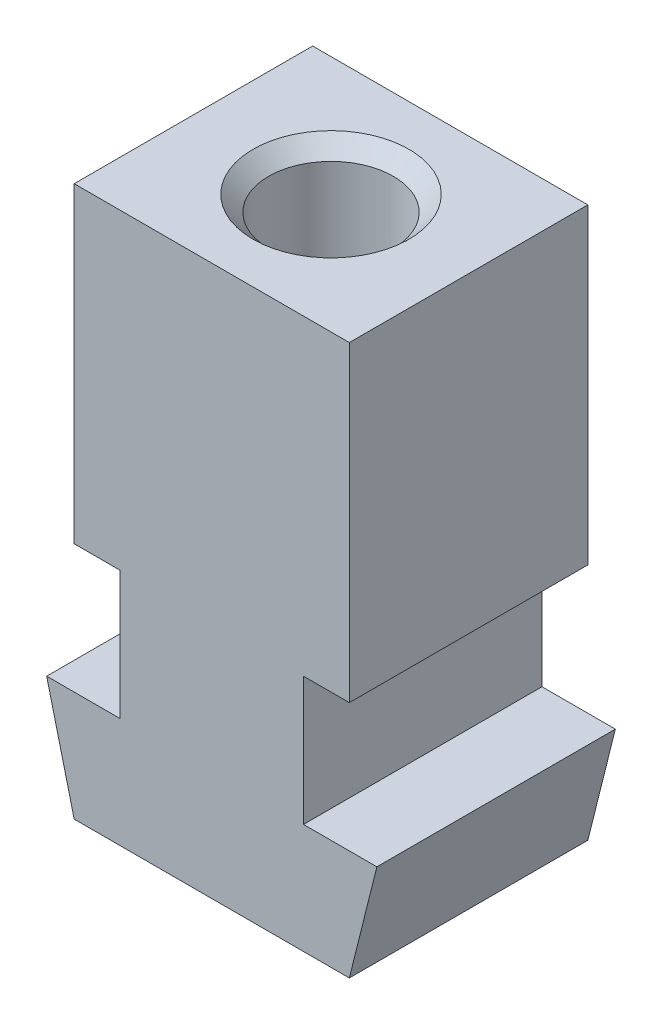
ISO-10303-21;
HEADER;
FILE_DESCRIPTION(('STEP AP214'),'2;1');
FILE_NAME('part.step','',(''),(''),'','','');
FILE_SCHEMA(('AUTOMOTIVE_DESIGN { 1 0 10303 214 1 1 1 1 }'));
ENDSEC;
DATA;
#1=APPLICATION_CONTEXT('core data for automotive mechanical design processes');
#2=APPLICATION_PROTOCOL_DEFINITION('international standard','automotive_design',2000,#1);
#3=PRODUCT_CONTEXT('',#1,'mechanical');
#4=PRODUCT('Part','Part','',(#3));
#5=PRODUCT_RELATED_PRODUCT_CATEGORY('part','',(#4));
#6=PRODUCT_DEFINITION_FORMATION('','',#4);
#7=PRODUCT_DEFINITION_CONTEXT('part definition',#1,'design');
#8=PRODUCT_DEFINITION('design','',#6,#7);
#9=PRODUCT_DEFINITION_SHAPE('','',#8);
#10=(LENGTH_UNIT() NAMED_UNIT(*) SI_UNIT(.MILLI.,.METRE.));
#11=(NAMED_UNIT(*) PLANE_ANGLE_UNIT() SI_UNIT($,.RADIAN.));
#12=(NAMED_UNIT(*) SI_UNIT($,.STERADIAN.) SOLID_ANGLE_UNIT());
#13=UNCERTAINTY_MEASURE_WITH_UNIT(LENGTH_MEASURE(1.E-05),#10,'distance_accuracy_value','');
#14=(GEOMETRIC_REPRESENTATION_CONTEXT(3) GLOBAL_UNCERTAINTY_ASSIGNED_CONTEXT((#13)) GLOBAL_UNIT_ASSIGNED_CONTEXT((#10,
#11,#12)) REPRESENTATION_CONTEXT('',''));
#15=CARTESIAN_POINT('',(0.,0.,0.));
#16=DIRECTION('',(0.,0.,1.));
#17=DIRECTION('',(1.,0.,0.));
#18=AXIS2_PLACEMENT_3D('',#15,#16,#17);
#19=CARTESIAN_POINT('',(0.,30.,0.));
#20=DIRECTION('',(0.,1.,0.));
#21=DIRECTION('',(0.,0.,1.));
#22=AXIS2_PLACEMENT_3D('',#19,#20,#21);
#23=CYLINDRICAL_SURFACE('',#22,3.39999999999999);
#24=CARTESIAN_POINT('',(0.,0.850000000014006,0.));
#25=DIRECTION('',(0.,-1.,0.));
#26=DIRECTION('',(0.,0.,-1.));
#27=AXIS2_PLACEMENT_3D('',#24,#25,#26);
#28=CIRCLE('',#27,3.39999999994234);
#29=CARTESIAN_POINT('',(0.,0.850000000014006,-3.39999999994234));
#30=VERTEX_POINT('',#29);
#31=EDGE_CURVE('E138',#30,#30,#28,.T.);
#32=ORIENTED_EDGE('',*,*,#31,.T.);
#33=EDGE_LOOP('',(#32));
#34=FACE_BOUND('',#33,.T.);
#35=CARTESIAN_POINT('',(0.,29.1499999999587,0.));
#36=DIRECTION('',(0.,1.,0.));
#37=DIRECTION('',(0.,0.,1.));
#38=AXIS2_PLACEMENT_3D('',#35,#36,#37);
#39=CIRCLE('',#38,3.40000000005602);
#40=CARTESIAN_POINT('',(0.,29.1499999999587,3.40000000005602));
#41=VERTEX_POINT('',#40);
#42=EDGE_CURVE('E117',#41,#41,#39,.T.);
#43=ORIENTED_EDGE('',*,*,#42,.T.);
#44=EDGE_LOOP('',(#43));
#45=FACE_BOUND('',#44,.T.);
#46=ADVANCED_FACE('F15',(#34,#45),#23,.F.);
#47=CARTESIAN_POINT('',(0.,0.,0.));
#48=DIRECTION('',(0.,-1.,0.));
#49=DIRECTION('',(0.,0.,-1.));
#50=AXIS2_PLACEMENT_3D('',#47,#48,#49);
#51=CONICAL_SURFACE('',#50,4.25000000001319,0.785398163430886);
#52=CARTESIAN_POINT('',(0.,0.,0.));
#53=DIRECTION('',(0.,-1.,0.));
#54=DIRECTION('',(0.,0.,-1.));
#55=AXIS2_PLACEMENT_3D('',#52,#53,#54);
#56=CIRCLE('',#55,4.25000000001319);
#57=CARTESIAN_POINT('',(0.,0.,-4.25000000001319));
#58=VERTEX_POINT('',#57);
#59=EDGE_CURVE('E18',#58,#58,#56,.T.);
#60=ORIENTED_EDGE('',*,*,#59,.T.);
#61=EDGE_LOOP('',(#60));
#62=FACE_BOUND('',#61,.T.);
#63=ORIENTED_EDGE('',*,*,#31,.F.);
#64=EDGE_LOOP('',(#63));
#65=FACE_BOUND('',#64,.T.);
#66=ADVANCED_FACE('F200',(#62,#65),#51,.F.);
#67=CARTESIAN_POINT('',(0.,29.9999999999727,0.));
#68=DIRECTION('',(0.,1.,0.));
#69=DIRECTION('',(0.,0.,1.));
#70=AXIS2_PLACEMENT_3D('',#67,#68,#69);
#71=CONICAL_SURFACE('',#70,4.25000000007003,0.785398163397448);
#72=ORIENTED_EDGE('',*,*,#42,.F.);
#73=EDGE_LOOP('',(#72));
#74=FACE_BOUND('',#73,.T.);
#75=CARTESIAN_POINT('',(0.,29.9999999999727,0.));
#76=DIRECTION('',(0.,1.,0.));
#77=DIRECTION('',(0.,0.,1.));
#78=AXIS2_PLACEMENT_3D('',#75,#76,#77);
#79=CIRCLE('',#78,4.25000000007003);
#80=CARTESIAN_POINT('',(0.,29.9999999999727,4.25000000007003));
#81=VERTEX_POINT('',#80);
#82=EDGE_CURVE('E141',#81,#81,#79,.T.);
#83=ORIENTED_EDGE('',*,*,#82,.T.);
#84=EDGE_LOOP('',(#83));
#85=FACE_BOUND('',#84,.T.);
#86=ADVANCED_FACE('F464',(#74,#85),#71,.F.);
#87=CARTESIAN_POINT('',(0.,0.,-6.5));
#88=DIRECTION('',(0.,0.,1.));
#89=DIRECTION('',(1.,0.,0.));
#90=AXIS2_PLACEMENT_3D('',#87,#88,#89);
#91=PLANE('',#90);
#92=DIRECTION('',(0.,1.,0.));
#93=VECTOR('',#92,1.);
#94=CARTESIAN_POINT('',(-5.00000000000001,13.,-6.5));
#95=LINE('',#94,#93);
#96=CARTESIAN_POINT('',(-5.00000000000001,6.,-6.5));
#97=VERTEX_POINT('',#96);
#98=CARTESIAN_POINT('',(-5.00000000000001,13.,-6.5));
#99=VERTEX_POINT('',#98);
#100=EDGE_CURVE('E289',#97,#99,#95,.T.);
#101=ORIENTED_EDGE('',*,*,#100,.T.);
#102=DIRECTION('',(1.,0.,0.));
#103=VECTOR('',#102,1.);
#104=CARTESIAN_POINT('',(-7.50000000000001,13.,-6.5));
#105=LINE('',#104,#103);
#106=CARTESIAN_POINT('',(-7.50000000000001,13.,-6.5));
#107=VERTEX_POINT('',#106);
#108=EDGE_CURVE('E296',#99,#107,#105,.F.);
#109=ORIENTED_EDGE('',*,*,#108,.T.);
#110=DIRECTION('',(0.,1.,0.));
#111=VECTOR('',#110,1.);
#112=CARTESIAN_POINT('',(-7.50000000000001,30.,-6.5));
#113=LINE('',#112,#111);
#114=CARTESIAN_POINT('',(-7.50000000000001,30.,-6.5));
#115=VERTEX_POINT('',#114);
#116=EDGE_CURVE('E303',#107,#115,#113,.T.);
#117=ORIENTED_EDGE('',*,*,#116,.T.);
#118=DIRECTION('',(1.,0.,0.));
#119=VECTOR('',#118,1.);
#120=CARTESIAN_POINT('',(-7.50000000000001,30.,-6.5));
#121=LINE('',#120,#119);
#122=CARTESIAN_POINT('',(7.50000000000001,30.,-6.5));
#123=VERTEX_POINT('',#122);
#124=EDGE_CURVE('E151',#115,#123,#121,.T.);
#125=ORIENTED_EDGE('',*,*,#124,.T.);
#126=DIRECTION('',(0.,-1.,0.));
#127=VECTOR('',#126,1.);
#128=CARTESIAN_POINT('',(7.50000000000001,30.,-6.5));
#129=LINE('',#128,#127);
#130=CARTESIAN_POINT('',(7.50000000000001,13.,-6.5));
#131=VERTEX_POINT('',#130);
#132=EDGE_CURVE('E145',#123,#131,#129,.T.);
#133=ORIENTED_EDGE('',*,*,#132,.T.);
#134=DIRECTION('',(1.,0.,0.));
#135=VECTOR('',#134,1.);
#136=CARTESIAN_POINT('',(7.50000000000001,13.,-6.5));
#137=LINE('',#136,#135);
#138=CARTESIAN_POINT('',(5.00000000000001,13.,-6.5));
#139=VERTEX_POINT('',#138);
#140=EDGE_CURVE('E161',#131,#139,#137,.F.);
#141=ORIENTED_EDGE('',*,*,#140,.T.);
#142=DIRECTION('',(0.,-1.,0.));
#143=VECTOR('',#142,1.);
#144=CARTESIAN_POINT('',(5.00000000000001,13.,-6.5));
#145=LINE('',#144,#143);
#146=CARTESIAN_POINT('',(5.00000000000001,6.,-6.5));
#147=VERTEX_POINT('',#146);
#148=EDGE_CURVE('E170',#139,#147,#145,.T.);
#149=ORIENTED_EDGE('',*,*,#148,.T.);
#150=DIRECTION('',(1.,0.,0.));
#151=VECTOR('',#150,1.);
#152=CARTESIAN_POINT('',(5.00000000000001,6.,-6.5));
#153=LINE('',#152,#151);
#154=CARTESIAN_POINT('',(9.00000000000001,5.99999999999999,-6.5));
#155=VERTEX_POINT('',#154);
#156=EDGE_CURVE('E177',#147,#155,#153,.T.);
#157=ORIENTED_EDGE('',*,*,#156,.T.);
#158=DIRECTION('',(-0.242535625036333,-0.970142500145332,0.));
#159=VECTOR('',#158,1.);
#160=CARTESIAN_POINT('',(9.00000000000001,5.99999999999999,-6.50000000000001));
#161=LINE('',#160,#159);
#162=CARTESIAN_POINT('',(7.50000000000001,0.,-6.5));
#163=VERTEX_POINT('',#162);
#164=EDGE_CURVE('E184',#155,#163,#161,.T.);
#165=ORIENTED_EDGE('',*,*,#164,.T.);
#166=DIRECTION('',(1.,0.,0.));
#167=VECTOR('',#166,1.);
#168=CARTESIAN_POINT('',(7.50000000000001,0.,-6.5));
#169=LINE('',#168,#167);
#170=CARTESIAN_POINT('',(-7.50000000000001,0.,-6.5));
#171=VERTEX_POINT('',#170);
#172=EDGE_CURVE('E121',#163,#171,#169,.F.);
#173=ORIENTED_EDGE('',*,*,#172,.T.);
#174=DIRECTION('',(-0.242535625036333,0.970142500145332,0.));
#175=VECTOR('',#174,1.);
#176=CARTESIAN_POINT('',(-9.00000000000001,5.99999999999999,-6.50000000000001));
#177=LINE('',#176,#175);
#178=CARTESIAN_POINT('',(-9.00000000000001,5.99999999999999,-6.5));
#179=VERTEX_POINT('',#178);
#180=EDGE_CURVE('E102',#171,#179,#177,.T.);
#181=ORIENTED_EDGE('',*,*,#180,.T.);
#182=DIRECTION('',(1.,0.,0.));
#183=VECTOR('',#182,1.);
#184=CARTESIAN_POINT('',(-5.00000000000001,6.,-6.5));
#185=LINE('',#184,#183);
#186=EDGE_CURVE('E107',#179,#97,#185,.T.);
#187=ORIENTED_EDGE('',*,*,#186,.T.);
#188=EDGE_LOOP('',(#101,#109,#117,#125,#133,#141,#149,#157,#165,#173,#181,#187));
#189=FACE_BOUND('',#188,.T.);
#190=ADVANCED_FACE('F119',(#189),#91,.F.);
#191=CARTESIAN_POINT('',(-5.00000000000001,6.,6.5));
#192=DIRECTION('',(0.,-1.,0.));
#193=DIRECTION('',(1.,0.,0.));
#194=AXIS2_PLACEMENT_3D('',#191,#192,#193);
#195=PLANE('',#194);
#196=DIRECTION('',(0.,0.,1.));
#197=VECTOR('',#196,1.);
#198=CARTESIAN_POINT('',(-9.00000000000001,5.99999999999999,6.5));
#199=LINE('',#198,#197);
#200=CARTESIAN_POINT('',(-9.00000000000001,5.99999999999999,6.5));
#201=VERTEX_POINT('',#200);
#202=EDGE_CURVE('E109',#179,#201,#199,.T.);
#203=ORIENTED_EDGE('',*,*,#202,.T.);
#204=DIRECTION('',(1.,0.,0.));
#205=VECTOR('',#204,1.);
#206=CARTESIAN_POINT('',(0.,6.,6.5));
#207=LINE('',#206,#205);
#208=CARTESIAN_POINT('',(-5.00000000000001,6.,6.5));
#209=VERTEX_POINT('',#208);
#210=EDGE_CURVE('E286',#209,#201,#207,.F.);
#211=ORIENTED_EDGE('',*,*,#210,.F.);
#212=DIRECTION('',(0.,0.,1.));
#213=VECTOR('',#212,1.);
#214=CARTESIAN_POINT('',(-5.00000000000001,6.,6.5));
#215=LINE('',#214,#213);
#216=EDGE_CURVE('E112',#209,#97,#215,.F.);
#217=ORIENTED_EDGE('',*,*,#216,.T.);
#218=ORIENTED_EDGE('',*,*,#186,.F.);
#219=EDGE_LOOP('',(#203,#211,#217,#218));
#220=FACE_BOUND('',#219,.T.);
#221=ADVANCED_FACE('F108',(#220),#195,.F.);
#222=CARTESIAN_POINT('',(-9.00000000000001,5.99999999999999,6.5));
#223=DIRECTION('',(0.970142500145332,0.242535625036333,0.));
#224=DIRECTION('',(-0.242535625036333,0.970142500145332,0.));
#225=AXIS2_PLACEMENT_3D('',#222,#223,#224);
#226=PLANE('',#225);
#227=DIRECTION('',(0.,0.,1.));
#228=VECTOR('',#227,1.);
#229=CARTESIAN_POINT('',(-7.50000000000001,0.,6.5));
#230=LINE('',#229,#228);
#231=CARTESIAN_POINT('',(-7.50000000000001,0.,6.5));
#232=VERTEX_POINT('',#231);
#233=EDGE_CURVE('E191',#171,#232,#230,.T.);
#234=ORIENTED_EDGE('',*,*,#233,.T.);
#235=DIRECTION('',(0.242535625036333,-0.970142500145332,0.));
#236=VECTOR('',#235,1.);
#237=CARTESIAN_POINT('',(-9.00000000000001,5.99999999999999,6.5));
#238=LINE('',#237,#236);
#239=EDGE_CURVE('E127',#201,#232,#238,.T.);
#240=ORIENTED_EDGE('',*,*,#239,.F.);
#241=ORIENTED_EDGE('',*,*,#202,.F.);
#242=ORIENTED_EDGE('',*,*,#180,.F.);
#243=EDGE_LOOP('',(#234,#240,#241,#242));
#244=FACE_BOUND('',#243,.T.);
#245=ADVANCED_FACE('F125',(#244),#226,.F.);
#246=CARTESIAN_POINT('',(7.50000000000001,0.,6.5));
#247=DIRECTION('',(0.,1.,0.));
#248=DIRECTION('',(0.,0.,1.));
#249=AXIS2_PLACEMENT_3D('',#246,#247,#248);
#250=PLANE('',#249);
#251=DIRECTION('',(0.,0.,1.));
#252=VECTOR('',#251,1.);
#253=CARTESIAN_POINT('',(7.50000000000001,0.,6.5));
#254=LINE('',#253,#252);
#255=CARTESIAN_POINT('',(7.50000000000001,0.,6.5));
#256=VERTEX_POINT('',#255);
#257=EDGE_CURVE('E187',#163,#256,#254,.T.);
#258=ORIENTED_EDGE('',*,*,#257,.T.);
#259=DIRECTION('',(1.,0.,0.));
#260=VECTOR('',#259,1.);
#261=CARTESIAN_POINT('',(0.,0.,6.5));
#262=LINE('',#261,#260);
#263=EDGE_CURVE('E278',#232,#256,#262,.T.);
#264=ORIENTED_EDGE('',*,*,#263,.F.);
#265=ORIENTED_EDGE('',*,*,#233,.F.);
#266=ORIENTED_EDGE('',*,*,#172,.F.);
#267=EDGE_LOOP('',(#258,#264,#265,#266));
#268=FACE_BOUND('',#267,.T.);
#269=ORIENTED_EDGE('',*,*,#59,.F.);
#270=EDGE_LOOP('',(#269));
#271=FACE_BOUND('',#270,.T.);
#272=ADVANCED_FACE('F203',(#268,#271),#250,.F.);
#273=CARTESIAN_POINT('',(9.00000000000001,5.99999999999999,6.5));
#274=DIRECTION('',(-0.970142500145332,0.242535625036333,0.));
#275=DIRECTION('',(-0.242535625036333,-0.970142500145332,0.));
#276=AXIS2_PLACEMENT_3D('',#273,#274,#275);
#277=PLANE('',#276);
#278=DIRECTION('',(0.,0.,1.));
#279=VECTOR('',#278,1.);
#280=CARTESIAN_POINT('',(9.00000000000001,5.99999999999999,6.5));
#281=LINE('',#280,#279);
#282=CARTESIAN_POINT('',(9.00000000000001,5.99999999999999,6.5));
#283=VERTEX_POINT('',#282);
#284=EDGE_CURVE('E181',#155,#283,#281,.T.);
#285=ORIENTED_EDGE('',*,*,#284,.T.);
#286=DIRECTION('',(0.242535625036333,0.970142500145332,0.));
#287=VECTOR('',#286,1.);
#288=CARTESIAN_POINT('',(7.50000000000001,0.,6.5));
#289=LINE('',#288,#287);
#290=EDGE_CURVE('E273',#256,#283,#289,.T.);
#291=ORIENTED_EDGE('',*,*,#290,.F.);
#292=ORIENTED_EDGE('',*,*,#257,.F.);
#293=ORIENTED_EDGE('',*,*,#164,.F.);
#294=EDGE_LOOP('',(#285,#291,#292,#293));
#295=FACE_BOUND('',#294,.T.);
#296=ADVANCED_FACE('F205',(#295),#277,.F.);
#297=CARTESIAN_POINT('',(5.00000000000001,6.,6.5));
#298=DIRECTION('',(0.,-1.,0.));
#299=DIRECTION('',(1.,0.,0.));
#300=AXIS2_PLACEMENT_3D('',#297,#298,#299);
#301=PLANE('',#300);
#302=DIRECTION('',(0.,0.,1.));
#303=VECTOR('',#302,1.);
#304=CARTESIAN_POINT('',(5.00000000000001,6.,6.5));
#305=LINE('',#304,#303);
#306=CARTESIAN_POINT('',(5.00000000000001,6.,6.5));
#307=VERTEX_POINT('',#306);
#308=EDGE_CURVE('E174',#147,#307,#305,.T.);
#309=ORIENTED_EDGE('',*,*,#308,.T.);
#310=DIRECTION('',(1.,0.,0.));
#311=VECTOR('',#310,1.);
#312=CARTESIAN_POINT('',(0.,5.99999999999999,6.5));
#313=LINE('',#312,#311);
#314=EDGE_CURVE('E261',#283,#307,#313,.F.);
#315=ORIENTED_EDGE('',*,*,#314,.F.);
#316=ORIENTED_EDGE('',*,*,#284,.F.);
#317=ORIENTED_EDGE('',*,*,#156,.F.);
#318=EDGE_LOOP('',(#309,#315,#316,#317));
#319=FACE_BOUND('',#318,.T.);
#320=ADVANCED_FACE('F213',(#319),#301,.F.);
#321=CARTESIAN_POINT('',(5.00000000000001,13.,6.5));
#322=DIRECTION('',(-1.,0.,0.));
#323=DIRECTION('',(0.,-1.,0.));
#324=AXIS2_PLACEMENT_3D('',#321,#322,#323);
#325=PLANE('',#324);
#326=DIRECTION('',(0.,0.,1.));
#327=VECTOR('',#326,1.);
#328=CARTESIAN_POINT('',(5.00000000000001,13.,6.5));
#329=LINE('',#328,#327);
#330=CARTESIAN_POINT('',(5.00000000000001,13.,6.5));
#331=VERTEX_POINT('',#330);
#332=EDGE_CURVE('E167',#139,#331,#329,.T.);
#333=ORIENTED_EDGE('',*,*,#332,.T.);
#334=DIRECTION('',(0.,1.,0.));
#335=VECTOR('',#334,1.);
#336=CARTESIAN_POINT('',(5.00000000000001,0.,6.5));
#337=LINE('',#336,#335);
#338=EDGE_CURVE('E264',#307,#331,#337,.T.);
#339=ORIENTED_EDGE('',*,*,#338,.F.);
#340=ORIENTED_EDGE('',*,*,#308,.F.);
#341=ORIENTED_EDGE('',*,*,#148,.F.);
#342=EDGE_LOOP('',(#333,#339,#340,#341));
#343=FACE_BOUND('',#342,.T.);
#344=ADVANCED_FACE('F247',(#343),#325,.F.);
#345=CARTESIAN_POINT('',(7.50000000000001,13.,6.5));
#346=DIRECTION('',(0.,1.,0.));
#347=DIRECTION('',(0.,0.,1.));
#348=AXIS2_PLACEMENT_3D('',#345,#346,#347);
#349=PLANE('',#348);
#350=DIRECTION('',(0.,0.,1.));
#351=VECTOR('',#350,1.);
#352=CARTESIAN_POINT('',(7.50000000000001,13.,6.5));
#353=LINE('',#352,#351);
#354=CARTESIAN_POINT('',(7.50000000000001,13.,6.5));
#355=VERTEX_POINT('',#354);
#356=EDGE_CURVE('E154',#131,#355,#353,.T.);
#357=ORIENTED_EDGE('',*,*,#356,.T.);
#358=DIRECTION('',(1.,0.,0.));
#359=VECTOR('',#358,1.);
#360=CARTESIAN_POINT('',(0.,13.,6.5));
#361=LINE('',#360,#359);
#362=EDGE_CURVE('E269',#331,#355,#361,.T.);
#363=ORIENTED_EDGE('',*,*,#362,.F.);
#364=ORIENTED_EDGE('',*,*,#332,.F.);
#365=ORIENTED_EDGE('',*,*,#140,.F.);
#366=EDGE_LOOP('',(#357,#363,#364,#365));
#367=FACE_BOUND('',#366,.T.);
#368=ADVANCED_FACE('F243',(#367),#349,.F.);
#369=CARTESIAN_POINT('',(7.50000000000001,30.,6.5));
#370=DIRECTION('',(-1.,0.,0.));
#371=DIRECTION('',(0.,-1.,0.));
#372=AXIS2_PLACEMENT_3D('',#369,#370,#371);
#373=PLANE('',#372);
#374=DIRECTION('',(0.,0.,-1.));
#375=VECTOR('',#374,1.);
#376=CARTESIAN_POINT('',(7.50000000000001,30.,6.5));
#377=LINE('',#376,#375);
#378=CARTESIAN_POINT('',(7.50000000000001,30.,6.5));
#379=VERTEX_POINT('',#378);
#380=EDGE_CURVE('E144',#123,#379,#377,.F.);
#381=ORIENTED_EDGE('',*,*,#380,.T.);
#382=DIRECTION('',(0.,1.,0.));
#383=VECTOR('',#382,1.);
#384=CARTESIAN_POINT('',(7.50000000000001,0.,6.5));
#385=LINE('',#384,#383);
#386=EDGE_CURVE('E319',#355,#379,#385,.T.);
#387=ORIENTED_EDGE('',*,*,#386,.F.);
#388=ORIENTED_EDGE('',*,*,#356,.F.);
#389=ORIENTED_EDGE('',*,*,#132,.F.);
#390=EDGE_LOOP('',(#381,#387,#388,#389));
#391=FACE_BOUND('',#390,.T.);
#392=ADVANCED_FACE('F239',(#391),#373,.F.);
#393=CARTESIAN_POINT('',(-7.50000000000001,30.,6.5));
#394=DIRECTION('',(0.,-1.,0.));
#395=DIRECTION('',(0.,0.,-1.));
#396=AXIS2_PLACEMENT_3D('',#393,#394,#395);
#397=PLANE('',#396);
#398=DIRECTION('',(0.,0.,1.));
#399=VECTOR('',#398,1.);
#400=CARTESIAN_POINT('',(-7.50000000000001,30.,6.5));
#401=LINE('',#400,#399);
#402=CARTESIAN_POINT('',(-7.50000000000001,30.,6.5));
#403=VERTEX_POINT('',#402);
#404=EDGE_CURVE('E307',#115,#403,#401,.T.);
#405=ORIENTED_EDGE('',*,*,#404,.T.);
#406=DIRECTION('',(1.,0.,0.));
#407=VECTOR('',#406,1.);
#408=CARTESIAN_POINT('',(0.,30.,6.5));
#409=LINE('',#408,#407);
#410=EDGE_CURVE('E316',#379,#403,#409,.F.);
#411=ORIENTED_EDGE('',*,*,#410,.F.);
#412=ORIENTED_EDGE('',*,*,#380,.F.);
#413=ORIENTED_EDGE('',*,*,#124,.F.);
#414=EDGE_LOOP('',(#405,#411,#412,#413));
#415=FACE_BOUND('',#414,.T.);
#416=ORIENTED_EDGE('',*,*,#82,.F.);
#417=EDGE_LOOP('',(#416));
#418=FACE_BOUND('',#417,.T.);
#419=ADVANCED_FACE('F235',(#415,#418),#397,.F.);
#420=CARTESIAN_POINT('',(-7.50000000000001,30.,6.5));
#421=DIRECTION('',(1.,0.,0.));
#422=DIRECTION('',(0.,1.,0.));
#423=AXIS2_PLACEMENT_3D('',#420,#421,#422);
#424=PLANE('',#423);
#425=DIRECTION('',(0.,0.,1.));
#426=VECTOR('',#425,1.);
#427=CARTESIAN_POINT('',(-7.50000000000001,13.,6.5));
#428=LINE('',#427,#426);
#429=CARTESIAN_POINT('',(-7.50000000000001,13.,6.5));
#430=VERTEX_POINT('',#429);
#431=EDGE_CURVE('E300',#107,#430,#428,.T.);
#432=ORIENTED_EDGE('',*,*,#431,.T.);
#433=DIRECTION('',(0.,1.,0.));
#434=VECTOR('',#433,1.);
#435=CARTESIAN_POINT('',(-7.50000000000001,0.,6.5));
#436=LINE('',#435,#434);
#437=EDGE_CURVE('E324',#403,#430,#436,.F.);
#438=ORIENTED_EDGE('',*,*,#437,.F.);
#439=ORIENTED_EDGE('',*,*,#404,.F.);
#440=ORIENTED_EDGE('',*,*,#116,.F.);
#441=EDGE_LOOP('',(#432,#438,#439,#440));
#442=FACE_BOUND('',#441,.T.);
#443=ADVANCED_FACE('F232',(#442),#424,.F.);
#444=CARTESIAN_POINT('',(-7.50000000000001,13.,6.5));
#445=DIRECTION('',(0.,1.,0.));
#446=DIRECTION('',(0.,0.,1.));
#447=AXIS2_PLACEMENT_3D('',#444,#445,#446);
#448=PLANE('',#447);
#449=DIRECTION('',(0.,0.,1.));
#450=VECTOR('',#449,1.);
#451=CARTESIAN_POINT('',(-5.00000000000001,13.,6.5));
#452=LINE('',#451,#450);
#453=CARTESIAN_POINT('',(-5.00000000000001,13.,6.5));
#454=VERTEX_POINT('',#453);
#455=EDGE_CURVE('E34',#99,#454,#452,.T.);
#456=ORIENTED_EDGE('',*,*,#455,.T.);
#457=DIRECTION('',(1.,0.,0.));
#458=VECTOR('',#457,1.);
#459=CARTESIAN_POINT('',(0.,13.,6.5));
#460=LINE('',#459,#458);
#461=EDGE_CURVE('E25',#430,#454,#460,.T.);
#462=ORIENTED_EDGE('',*,*,#461,.F.);
#463=ORIENTED_EDGE('',*,*,#431,.F.);
#464=ORIENTED_EDGE('',*,*,#108,.F.);
#465=EDGE_LOOP('',(#456,#462,#463,#464));
#466=FACE_BOUND('',#465,.T.);
#467=ADVANCED_FACE('F225',(#466),#448,.F.);
#468=CARTESIAN_POINT('',(-5.00000000000001,13.,6.5));
#469=DIRECTION('',(1.,0.,0.));
#470=DIRECTION('',(0.,1.,0.));
#471=AXIS2_PLACEMENT_3D('',#468,#469,#470);
#472=PLANE('',#471);
#473=ORIENTED_EDGE('',*,*,#216,.F.);
#474=DIRECTION('',(0.,1.,0.));
#475=VECTOR('',#474,1.);
#476=CARTESIAN_POINT('',(-5.00000000000001,0.,6.5));
#477=LINE('',#476,#475);
#478=EDGE_CURVE('E10',#454,#209,#477,.F.);
#479=ORIENTED_EDGE('',*,*,#478,.F.);
#480=ORIENTED_EDGE('',*,*,#455,.F.);
#481=ORIENTED_EDGE('',*,*,#100,.F.);
#482=EDGE_LOOP('',(#473,#479,#480,#481));
#483=FACE_BOUND('',#482,.T.);
#484=ADVANCED_FACE('F219',(#483),#472,.F.);
#485=CARTESIAN_POINT('',(0.,0.,6.5));
#486=DIRECTION('',(0.,0.,1.));
#487=DIRECTION('',(1.,0.,0.));
#488=AXIS2_PLACEMENT_3D('',#485,#486,#487);
#489=PLANE('',#488);
#490=ORIENTED_EDGE('',*,*,#461,.T.);
#491=ORIENTED_EDGE('',*,*,#478,.T.);
#492=ORIENTED_EDGE('',*,*,#210,.T.);
#493=ORIENTED_EDGE('',*,*,#239,.T.);
#494=ORIENTED_EDGE('',*,*,#263,.T.);
#495=ORIENTED_EDGE('',*,*,#290,.T.);
#496=ORIENTED_EDGE('',*,*,#314,.T.);
#497=ORIENTED_EDGE('',*,*,#338,.T.);
#498=ORIENTED_EDGE('',*,*,#362,.T.);
#499=ORIENTED_EDGE('',*,*,#386,.T.);
#500=ORIENTED_EDGE('',*,*,#410,.T.);
#501=ORIENTED_EDGE('',*,*,#437,.T.);
#502=EDGE_LOOP('',(#490,#491,#492,#493,#494,#495,#496,#497,#498,#499,#500,#501));
#503=FACE_BOUND('',#502,.T.);
#504=ADVANCED_FACE('F217',(#503),#489,.T.);
#505=CLOSED_SHELL('',(#46,#66,#86,#190,#221,#245,#272,#296,#320,#344,#368,#392,#419,#443,#467,
#484,#504));
#506=MANIFOLD_SOLID_BREP('B1',#505);
#507=ADVANCED_BREP_SHAPE_REPRESENTATION('',(#18,#506),#14);
#508=SHAPE_DEFINITION_REPRESENTATION(#9,#507);
ENDSEC;
END-ISO-10303-21;
